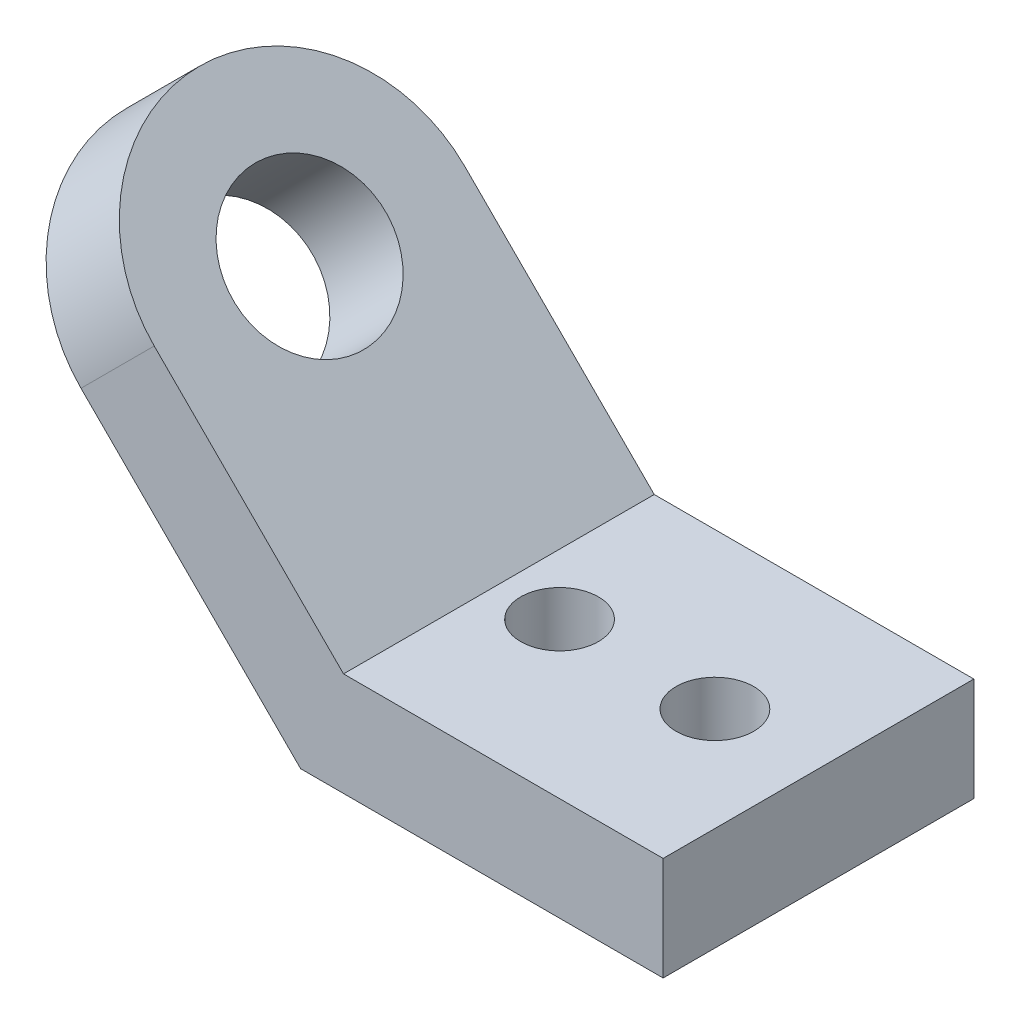
ISO-10303-21;
HEADER;
FILE_DESCRIPTION(('STEP AP214'),'2;1');
FILE_NAME('part.step','',(''),(''),'','','');
FILE_SCHEMA(('AUTOMOTIVE_DESIGN { 1 0 10303 214 1 1 1 1 }'));
ENDSEC;
DATA;
#1=APPLICATION_CONTEXT('core data for automotive mechanical design processes');
#2=APPLICATION_PROTOCOL_DEFINITION('international standard','automotive_design',2000,#1);
#3=PRODUCT_CONTEXT('',#1,'mechanical');
#4=PRODUCT('Part','Part','',(#3));
#5=PRODUCT_RELATED_PRODUCT_CATEGORY('part','',(#4));
#6=PRODUCT_DEFINITION_FORMATION('','',#4);
#7=PRODUCT_DEFINITION_CONTEXT('part definition',#1,'design');
#8=PRODUCT_DEFINITION('design','',#6,#7);
#9=PRODUCT_DEFINITION_SHAPE('','',#8);
#10=(LENGTH_UNIT() NAMED_UNIT(*) SI_UNIT(.MILLI.,.METRE.));
#11=(NAMED_UNIT(*) PLANE_ANGLE_UNIT() SI_UNIT($,.RADIAN.));
#12=(NAMED_UNIT(*) SI_UNIT($,.STERADIAN.) SOLID_ANGLE_UNIT());
#13=UNCERTAINTY_MEASURE_WITH_UNIT(LENGTH_MEASURE(1.E-05),#10,'distance_accuracy_value','');
#14=(GEOMETRIC_REPRESENTATION_CONTEXT(3) GLOBAL_UNCERTAINTY_ASSIGNED_CONTEXT((#13)) GLOBAL_UNIT_ASSIGNED_CONTEXT((#10,
#11,#12)) REPRESENTATION_CONTEXT('',''));
#15=CARTESIAN_POINT('',(0.,0.,0.));
#16=DIRECTION('',(0.,0.,1.));
#17=DIRECTION('',(1.,0.,0.));
#18=AXIS2_PLACEMENT_3D('',#15,#16,#17);
#19=CARTESIAN_POINT('',(-92.8558482918548,92.8558482918553,-152.4));
#20=DIRECTION('',(0.707106781186549,0.707106781186545,0.));
#21=DIRECTION('',(-0.707106781186546,0.70710678118655,0.));
#22=AXIS2_PLACEMENT_3D('',#19,#20,#21);
#23=PLANE('',#22);
#24=CARTESIAN_POINT('',(-92.8558482918548,92.8558482918553,-76.2));
#25=DIRECTION('',(0.707106781186549,0.707106781186546,0.));
#26=DIRECTION('',(-0.707106781186546,0.707106781186549,0.));
#27=AXIS2_PLACEMENT_3D('',#24,#25,#26);
#28=CIRCLE('',#27,37.465);
#29=CARTESIAN_POINT('',(-119.347603849009,119.347603849009,-76.2));
#30=VERTEX_POINT('',#29);
#31=EDGE_CURVE('E147',#30,#30,#28,.T.);
#32=ORIENTED_EDGE('',*,*,#31,.F.);
#33=EDGE_LOOP('',(#32));
#34=FACE_BOUND('',#33,.T.);
#35=DIRECTION('',(-0.707106781186545,0.707106781186549,0.));
#36=VECTOR('',#35,1.);
#37=CARTESIAN_POINT('',(-92.8558482918548,92.8558482918553,-152.4));
#38=LINE('',#37,#36);
#39=CARTESIAN_POINT('',(0.,0.,-152.4));
#40=VERTEX_POINT('',#39);
#41=CARTESIAN_POINT('',(-92.8558482918549,92.8558482918552,-152.4));
#42=VERTEX_POINT('',#41);
#43=EDGE_CURVE('E115',#40,#42,#38,.T.);
#44=ORIENTED_EDGE('',*,*,#43,.T.);
#45=CARTESIAN_POINT('',(-92.8558482918549,92.8558482918552,-76.2));
#46=DIRECTION('',(0.707106781186549,0.707106781186546,0.));
#47=DIRECTION('',(-0.707106781186546,0.707106781186549,0.));
#48=AXIS2_PLACEMENT_3D('',#45,#46,#47);
#49=CIRCLE('',#48,76.2);
#50=CARTESIAN_POINT('',(-92.8558482918549,92.8558482918552,0.));
#51=VERTEX_POINT('',#50);
#52=EDGE_CURVE('E103',#42,#51,#49,.T.);
#53=ORIENTED_EDGE('',*,*,#52,.T.);
#54=DIRECTION('',(-0.707106781186545,0.707106781186549,0.));
#55=VECTOR('',#54,1.);
#56=CARTESIAN_POINT('',(-92.8558482918548,92.8558482918553,0.));
#57=LINE('',#56,#55);
#58=CARTESIAN_POINT('',(0.,0.,0.));
#59=VERTEX_POINT('',#58);
#60=EDGE_CURVE('E112',#59,#51,#57,.T.);
#61=ORIENTED_EDGE('',*,*,#60,.F.);
#62=DIRECTION('',(0.,0.,1.));
#63=VECTOR('',#62,1.);
#64=CARTESIAN_POINT('',(0.,0.,-152.4));
#65=LINE('',#64,#63);
#66=EDGE_CURVE('E11',#40,#59,#65,.T.);
#67=ORIENTED_EDGE('',*,*,#66,.F.);
#68=EDGE_LOOP('',(#44,#53,#61,#67));
#69=FACE_BOUND('',#68,.T.);
#70=ADVANCED_FACE('F41',(#34,#69),#23,.T.);
#71=CARTESIAN_POINT('',(0.,0.,-152.4));
#72=DIRECTION('',(0.,1.,0.));
#73=DIRECTION('',(0.,0.,1.));
#74=AXIS2_PLACEMENT_3D('',#71,#72,#73);
#75=PLANE('',#74);
#76=CARTESIAN_POINT('',(29.7579510314467,0.,-76.2));
#77=DIRECTION('',(0.,1.,0.));
#78=DIRECTION('',(0.,0.,1.));
#79=AXIS2_PLACEMENT_3D('',#76,#77,#78);
#80=CIRCLE('',#79,19.05);
#81=CARTESIAN_POINT('',(29.7579510314467,0.,-57.15));
#82=VERTEX_POINT('',#81);
#83=EDGE_CURVE('E159',#82,#82,#80,.T.);
#84=ORIENTED_EDGE('',*,*,#83,.F.);
#85=EDGE_LOOP('',(#84));
#86=FACE_BOUND('',#85,.T.);
#87=CARTESIAN_POINT('',(105.957951031447,0.,-76.2));
#88=DIRECTION('',(0.,1.,0.));
#89=DIRECTION('',(0.,0.,1.));
#90=AXIS2_PLACEMENT_3D('',#87,#88,#89);
#91=CIRCLE('',#90,19.05);
#92=CARTESIAN_POINT('',(105.957951031447,0.,-57.15));
#93=VERTEX_POINT('',#92);
#94=EDGE_CURVE('E156',#93,#93,#91,.T.);
#95=ORIENTED_EDGE('',*,*,#94,.F.);
#96=EDGE_LOOP('',(#95));
#97=FACE_BOUND('',#96,.T.);
#98=DIRECTION('',(-1.,0.,0.));
#99=VECTOR('',#98,1.);
#100=CARTESIAN_POINT('',(0.,0.,0.));
#101=LINE('',#100,#99);
#102=CARTESIAN_POINT('',(156.757951031447,0.,0.));
#103=VERTEX_POINT('',#102);
#104=EDGE_CURVE('E119',#103,#59,#101,.T.);
#105=ORIENTED_EDGE('',*,*,#104,.F.);
#106=DIRECTION('',(0.,0.,1.));
#107=VECTOR('',#106,1.);
#108=CARTESIAN_POINT('',(156.757951031447,0.,-152.4));
#109=LINE('',#108,#107);
#110=CARTESIAN_POINT('',(156.757951031447,0.,-152.4));
#111=VERTEX_POINT('',#110);
#112=EDGE_CURVE('E50',#111,#103,#109,.T.);
#113=ORIENTED_EDGE('',*,*,#112,.F.);
#114=DIRECTION('',(-1.,0.,0.));
#115=VECTOR('',#114,1.);
#116=CARTESIAN_POINT('',(0.,0.,-152.4));
#117=LINE('',#116,#115);
#118=EDGE_CURVE('E123',#111,#40,#117,.T.);
#119=ORIENTED_EDGE('',*,*,#118,.T.);
#120=ORIENTED_EDGE('',*,*,#66,.T.);
#121=EDGE_LOOP('',(#105,#113,#119,#120));
#122=FACE_BOUND('',#121,.T.);
#123=ADVANCED_FACE('F175',(#86,#97,#122),#75,.T.);
#124=CARTESIAN_POINT('',(156.757951031447,0.,-152.4));
#125=DIRECTION('',(1.,0.,0.));
#126=DIRECTION('',(0.,0.,-1.));
#127=AXIS2_PLACEMENT_3D('',#124,#125,#126);
#128=PLANE('',#127);
#129=DIRECTION('',(0.,1.,0.));
#130=VECTOR('',#129,1.);
#131=CARTESIAN_POINT('',(156.757951031447,0.,0.));
#132=LINE('',#131,#130);
#133=CARTESIAN_POINT('',(156.757951031447,-50.8,0.));
#134=VERTEX_POINT('',#133);
#135=EDGE_CURVE('E130',#134,#103,#132,.T.);
#136=ORIENTED_EDGE('',*,*,#135,.F.);
#137=DIRECTION('',(0.,0.,1.));
#138=VECTOR('',#137,1.);
#139=CARTESIAN_POINT('',(156.757951031447,-50.8,-152.4));
#140=LINE('',#139,#138);
#141=CARTESIAN_POINT('',(156.757951031447,-50.8,-152.4));
#142=VERTEX_POINT('',#141);
#143=EDGE_CURVE('E133',#142,#134,#140,.T.);
#144=ORIENTED_EDGE('',*,*,#143,.F.);
#145=DIRECTION('',(0.,1.,0.));
#146=VECTOR('',#145,1.);
#147=CARTESIAN_POINT('',(156.757951031447,0.,-152.4));
#148=LINE('',#147,#146);
#149=EDGE_CURVE('E136',#142,#111,#148,.T.);
#150=ORIENTED_EDGE('',*,*,#149,.T.);
#151=ORIENTED_EDGE('',*,*,#112,.T.);
#152=EDGE_LOOP('',(#136,#144,#150,#151));
#153=FACE_BOUND('',#152,.T.);
#154=ADVANCED_FACE('F178',(#153),#128,.T.);
#155=CARTESIAN_POINT('',(156.757951031447,-50.8,-152.4));
#156=DIRECTION('',(0.,-1.,0.));
#157=DIRECTION('',(1.,0.,0.));
#158=AXIS2_PLACEMENT_3D('',#155,#156,#157);
#159=PLANE('',#158);
#160=CARTESIAN_POINT('',(29.7579510314467,-50.8,-76.2));
#161=DIRECTION('',(0.,1.,0.));
#162=DIRECTION('',(0.,0.,1.));
#163=AXIS2_PLACEMENT_3D('',#160,#161,#162);
#164=CIRCLE('',#163,19.05);
#165=CARTESIAN_POINT('',(29.7579510314467,-50.8,-57.15));
#166=VERTEX_POINT('',#165);
#167=EDGE_CURVE('E150',#166,#166,#164,.T.);
#168=ORIENTED_EDGE('',*,*,#167,.T.);
#169=EDGE_LOOP('',(#168));
#170=FACE_BOUND('',#169,.T.);
#171=CARTESIAN_POINT('',(105.957951031447,-50.8,-76.2));
#172=DIRECTION('',(0.,1.,0.));
#173=DIRECTION('',(0.,0.,1.));
#174=AXIS2_PLACEMENT_3D('',#171,#172,#173);
#175=CIRCLE('',#174,19.05);
#176=CARTESIAN_POINT('',(105.957951031447,-50.8,-57.15));
#177=VERTEX_POINT('',#176);
#178=EDGE_CURVE('E153',#177,#177,#175,.T.);
#179=ORIENTED_EDGE('',*,*,#178,.T.);
#180=EDGE_LOOP('',(#179));
#181=FACE_BOUND('',#180,.T.);
#182=DIRECTION('',(1.,0.,0.));
#183=VECTOR('',#182,1.);
#184=CARTESIAN_POINT('',(156.757951031447,-50.8,0.));
#185=LINE('',#184,#183);
#186=CARTESIAN_POINT('',(-21.0420489685533,-50.8,0.));
#187=VERTEX_POINT('',#186);
#188=EDGE_CURVE('E127',#187,#134,#185,.T.);
#189=ORIENTED_EDGE('',*,*,#188,.F.);
#190=DIRECTION('',(0.,0.,1.));
#191=VECTOR('',#190,1.);
#192=CARTESIAN_POINT('',(-21.0420489685533,-50.8,-152.4));
#193=LINE('',#192,#191);
#194=CARTESIAN_POINT('',(-21.0420489685533,-50.8,-152.4));
#195=VERTEX_POINT('',#194);
#196=EDGE_CURVE('E44',#195,#187,#193,.T.);
#197=ORIENTED_EDGE('',*,*,#196,.F.);
#198=DIRECTION('',(1.,0.,0.));
#199=VECTOR('',#198,1.);
#200=CARTESIAN_POINT('',(156.757951031447,-50.8,-152.4));
#201=LINE('',#200,#199);
#202=EDGE_CURVE('E138',#195,#142,#201,.T.);
#203=ORIENTED_EDGE('',*,*,#202,.T.);
#204=ORIENTED_EDGE('',*,*,#143,.T.);
#205=EDGE_LOOP('',(#189,#197,#203,#204));
#206=FACE_BOUND('',#205,.T.);
#207=ADVANCED_FACE('F165',(#170,#181,#206),#159,.T.);
#208=CARTESIAN_POINT('',(-21.0420489685533,-50.8,-152.4));
#209=DIRECTION('',(-0.70710678118655,-0.707106781186545,0.));
#210=DIRECTION('',(0.707106781186545,-0.70710678118655,0.));
#211=AXIS2_PLACEMENT_3D('',#208,#209,#210);
#212=PLANE('',#211);
#213=CARTESIAN_POINT('',(-128.776872776131,56.9348238075788,-76.2));
#214=DIRECTION('',(0.707106781186549,0.707106781186546,0.));
#215=DIRECTION('',(-0.707106781186546,0.707106781186549,0.));
#216=AXIS2_PLACEMENT_3D('',#213,#214,#215);
#217=CIRCLE('',#216,37.465);
#218=CARTESIAN_POINT('',(-155.268628333285,83.4265793647328,-76.2));
#219=VERTEX_POINT('',#218);
#220=EDGE_CURVE('E116',#219,#219,#217,.T.);
#221=ORIENTED_EDGE('',*,*,#220,.T.);
#222=EDGE_LOOP('',(#221));
#223=FACE_BOUND('',#222,.T.);
#224=DIRECTION('',(0.707106781186545,-0.70710678118655,0.));
#225=VECTOR('',#224,1.);
#226=CARTESIAN_POINT('',(-21.0420489685533,-50.8,0.));
#227=LINE('',#226,#225);
#228=CARTESIAN_POINT('',(-128.776872776131,56.9348238075787,0.));
#229=VERTEX_POINT('',#228);
#230=EDGE_CURVE('E111',#229,#187,#227,.T.);
#231=ORIENTED_EDGE('',*,*,#230,.F.);
#232=CARTESIAN_POINT('',(-128.776872776132,56.9348238075786,-76.2));
#233=DIRECTION('',(0.707106781186549,0.707106781186546,0.));
#234=DIRECTION('',(-0.707106781186546,0.707106781186549,0.));
#235=AXIS2_PLACEMENT_3D('',#232,#233,#234);
#236=CIRCLE('',#235,76.2);
#237=CARTESIAN_POINT('',(-128.776872776132,56.9348238075786,-152.4));
#238=VERTEX_POINT('',#237);
#239=EDGE_CURVE('E106',#238,#229,#236,.T.);
#240=ORIENTED_EDGE('',*,*,#239,.F.);
#241=DIRECTION('',(0.707106781186545,-0.70710678118655,0.));
#242=VECTOR('',#241,1.);
#243=CARTESIAN_POINT('',(-21.0420489685533,-50.8,-152.4));
#244=LINE('',#243,#242);
#245=EDGE_CURVE('E140',#238,#195,#244,.T.);
#246=ORIENTED_EDGE('',*,*,#245,.T.);
#247=ORIENTED_EDGE('',*,*,#196,.T.);
#248=EDGE_LOOP('',(#231,#240,#246,#247));
#249=FACE_BOUND('',#248,.T.);
#250=ADVANCED_FACE('F223',(#223,#249),#212,.T.);
#251=CARTESIAN_POINT('',(0.,0.,-152.4));
#252=DIRECTION('',(0.,0.,1.));
#253=DIRECTION('',(1.,0.,0.));
#254=AXIS2_PLACEMENT_3D('',#251,#252,#253);
#255=PLANE('',#254);
#256=ORIENTED_EDGE('',*,*,#43,.F.);
#257=ORIENTED_EDGE('',*,*,#118,.F.);
#258=ORIENTED_EDGE('',*,*,#149,.F.);
#259=ORIENTED_EDGE('',*,*,#202,.F.);
#260=ORIENTED_EDGE('',*,*,#245,.F.);
#261=DIRECTION('',(-0.707106781186548,-0.707106781186548,0.));
#262=VECTOR('',#261,1.);
#263=CARTESIAN_POINT('',(-128.776872776131,56.9348238075787,-152.4));
#264=LINE('',#263,#262);
#265=EDGE_CURVE('E144',#42,#238,#264,.T.);
#266=ORIENTED_EDGE('',*,*,#265,.F.);
#267=EDGE_LOOP('',(#256,#257,#258,#259,#260,#266));
#268=FACE_BOUND('',#267,.T.);
#269=ADVANCED_FACE('F232',(#268),#255,.F.);
#270=CARTESIAN_POINT('',(0.,0.,0.));
#271=DIRECTION('',(0.,0.,1.));
#272=DIRECTION('',(1.,0.,0.));
#273=AXIS2_PLACEMENT_3D('',#270,#271,#272);
#274=PLANE('',#273);
#275=ORIENTED_EDGE('',*,*,#60,.T.);
#276=DIRECTION('',(-0.707106781186548,-0.707106781186548,0.));
#277=VECTOR('',#276,1.);
#278=CARTESIAN_POINT('',(-128.776872776131,56.9348238075787,0.));
#279=LINE('',#278,#277);
#280=EDGE_CURVE('E100',#51,#229,#279,.T.);
#281=ORIENTED_EDGE('',*,*,#280,.T.);
#282=ORIENTED_EDGE('',*,*,#230,.T.);
#283=ORIENTED_EDGE('',*,*,#188,.T.);
#284=ORIENTED_EDGE('',*,*,#135,.T.);
#285=ORIENTED_EDGE('',*,*,#104,.T.);
#286=EDGE_LOOP('',(#275,#281,#282,#283,#284,#285));
#287=FACE_BOUND('',#286,.T.);
#288=ADVANCED_FACE('F118',(#287),#274,.T.);
#289=CARTESIAN_POINT('',(-128.776872776132,56.9348238075786,-76.2));
#290=DIRECTION('',(0.707106781186548,0.707106781186546,0.));
#291=DIRECTION('',(-0.707106781186547,0.707106781186549,0.));
#292=AXIS2_PLACEMENT_3D('',#289,#290,#291);
#293=CYLINDRICAL_SURFACE('',#292,76.2);
#294=ORIENTED_EDGE('',*,*,#265,.T.);
#295=ORIENTED_EDGE('',*,*,#239,.T.);
#296=ORIENTED_EDGE('',*,*,#280,.F.);
#297=ORIENTED_EDGE('',*,*,#52,.F.);
#298=EDGE_LOOP('',(#294,#295,#296,#297));
#299=FACE_BOUND('',#298,.T.);
#300=ADVANCED_FACE('F102',(#299),#293,.T.);
#301=CARTESIAN_POINT('',(-128.776872776131,56.9348238075788,-76.2));
#302=DIRECTION('',(0.707106781186549,0.707106781186546,0.));
#303=DIRECTION('',(-0.707106781186546,0.707106781186549,0.));
#304=AXIS2_PLACEMENT_3D('',#301,#302,#303);
#305=CYLINDRICAL_SURFACE('',#304,37.465);
#306=ORIENTED_EDGE('',*,*,#220,.F.);
#307=EDGE_LOOP('',(#306));
#308=FACE_BOUND('',#307,.T.);
#309=ORIENTED_EDGE('',*,*,#31,.T.);
#310=EDGE_LOOP('',(#309));
#311=FACE_BOUND('',#310,.T.);
#312=ADVANCED_FACE('F183',(#308,#311),#305,.F.);
#313=CARTESIAN_POINT('',(105.957951031447,-50.8,-76.2));
#314=DIRECTION('',(0.,1.,0.));
#315=DIRECTION('',(0.,0.,1.));
#316=AXIS2_PLACEMENT_3D('',#313,#314,#315);
#317=CYLINDRICAL_SURFACE('',#316,19.05);
#318=ORIENTED_EDGE('',*,*,#178,.F.);
#319=EDGE_LOOP('',(#318));
#320=FACE_BOUND('',#319,.T.);
#321=ORIENTED_EDGE('',*,*,#94,.T.);
#322=EDGE_LOOP('',(#321));
#323=FACE_BOUND('',#322,.T.);
#324=ADVANCED_FACE('F171',(#320,#323),#317,.F.);
#325=CARTESIAN_POINT('',(29.7579510314467,-50.8,-76.2));
#326=DIRECTION('',(0.,1.,0.));
#327=DIRECTION('',(0.,0.,1.));
#328=AXIS2_PLACEMENT_3D('',#325,#326,#327);
#329=CYLINDRICAL_SURFACE('',#328,19.05);
#330=ORIENTED_EDGE('',*,*,#167,.F.);
#331=EDGE_LOOP('',(#330));
#332=FACE_BOUND('',#331,.T.);
#333=ORIENTED_EDGE('',*,*,#83,.T.);
#334=EDGE_LOOP('',(#333));
#335=FACE_BOUND('',#334,.T.);
#336=ADVANCED_FACE('F168',(#332,#335),#329,.F.);
#337=CLOSED_SHELL('',(#70,#123,#154,#207,#250,#269,#288,#300,#312,#324,#336));
#338=MANIFOLD_SOLID_BREP('B2',#337);
#339=ADVANCED_BREP_SHAPE_REPRESENTATION('',(#18,#338),#14);
#340=SHAPE_DEFINITION_REPRESENTATION(#9,#339);
ENDSEC;
END-ISO-10303-21;
